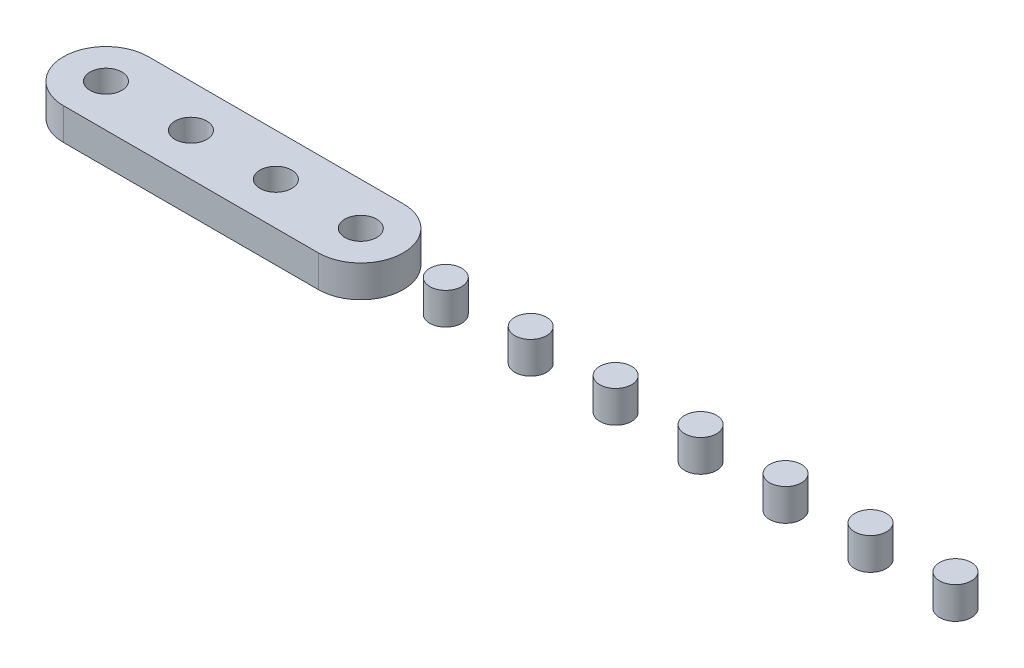
ISO-10303-21;
HEADER;
FILE_DESCRIPTION(('STEP AP214'),'2;1');
FILE_NAME('part.step','',(''),(''),'','','');
FILE_SCHEMA(('AUTOMOTIVE_DESIGN { 1 0 10303 214 1 1 1 1 }'));
ENDSEC;
DATA;
#1=APPLICATION_CONTEXT('core data for automotive mechanical design processes');
#2=APPLICATION_PROTOCOL_DEFINITION('international standard','automotive_design',2000,#1);
#3=PRODUCT_CONTEXT('',#1,'mechanical');
#4=PRODUCT('Part','Part','',(#3));
#5=PRODUCT_RELATED_PRODUCT_CATEGORY('part','',(#4));
#6=PRODUCT_DEFINITION_FORMATION('','',#4);
#7=PRODUCT_DEFINITION_CONTEXT('part definition',#1,'design');
#8=PRODUCT_DEFINITION('design','',#6,#7);
#9=PRODUCT_DEFINITION_SHAPE('','',#8);
#10=(LENGTH_UNIT() NAMED_UNIT(*) SI_UNIT(.MILLI.,.METRE.));
#11=(NAMED_UNIT(*) PLANE_ANGLE_UNIT() SI_UNIT($,.RADIAN.));
#12=(NAMED_UNIT(*) SI_UNIT($,.STERADIAN.) SOLID_ANGLE_UNIT());
#13=UNCERTAINTY_MEASURE_WITH_UNIT(LENGTH_MEASURE(1.E-05),#10,'distance_accuracy_value','');
#14=(GEOMETRIC_REPRESENTATION_CONTEXT(3) GLOBAL_UNCERTAINTY_ASSIGNED_CONTEXT((#13)) GLOBAL_UNIT_ASSIGNED_CONTEXT((#10,
#11,#12)) REPRESENTATION_CONTEXT('',''));
#15=CARTESIAN_POINT('',(0.,0.,0.));
#16=DIRECTION('',(0.,0.,1.));
#17=DIRECTION('',(1.,0.,0.));
#18=AXIS2_PLACEMENT_3D('',#15,#16,#17);
#19=CARTESIAN_POINT('',(80.,3.,0.));
#20=DIRECTION('',(0.,-1.,0.));
#21=DIRECTION('',(0.,0.,-1.));
#22=AXIS2_PLACEMENT_3D('',#19,#20,#21);
#23=CYLINDRICAL_SURFACE('',#22,1.5);
#24=CARTESIAN_POINT('',(80.,3.,0.));
#25=DIRECTION('',(0.,1.,0.));
#26=DIRECTION('',(0.,0.,1.));
#27=AXIS2_PLACEMENT_3D('',#24,#25,#26);
#28=CIRCLE('',#27,1.5);
#29=CARTESIAN_POINT('',(80.,3.,1.5));
#30=VERTEX_POINT('',#29);
#31=EDGE_CURVE('E11',#30,#30,#28,.T.);
#32=ORIENTED_EDGE('',*,*,#31,.F.);
#33=EDGE_LOOP('',(#32));
#34=FACE_BOUND('',#33,.T.);
#35=CARTESIAN_POINT('',(80.,0.,0.));
#36=DIRECTION('',(0.,1.,0.));
#37=DIRECTION('',(0.,0.,1.));
#38=AXIS2_PLACEMENT_3D('',#35,#36,#37);
#39=CIRCLE('',#38,1.5);
#40=CARTESIAN_POINT('',(80.,0.,1.5));
#41=VERTEX_POINT('',#40);
#42=EDGE_CURVE('E43',#41,#41,#39,.T.);
#43=ORIENTED_EDGE('',*,*,#42,.T.);
#44=EDGE_LOOP('',(#43));
#45=FACE_BOUND('',#44,.T.);
#46=ADVANCED_FACE('F40',(#34,#45),#23,.T.);
#47=CARTESIAN_POINT('',(80.,3.,0.));
#48=DIRECTION('',(0.,1.,0.));
#49=DIRECTION('',(0.,0.,1.));
#50=AXIS2_PLACEMENT_3D('',#47,#48,#49);
#51=PLANE('',#50);
#52=ORIENTED_EDGE('',*,*,#31,.T.);
#53=EDGE_LOOP('',(#52));
#54=FACE_BOUND('',#53,.T.);
#55=ADVANCED_FACE('F55',(#54),#51,.T.);
#56=CARTESIAN_POINT('',(80.,0.,0.));
#57=DIRECTION('',(0.,1.,0.));
#58=DIRECTION('',(0.,0.,1.));
#59=AXIS2_PLACEMENT_3D('',#56,#57,#58);
#60=PLANE('',#59);
#61=ORIENTED_EDGE('',*,*,#42,.F.);
#62=EDGE_LOOP('',(#61));
#63=FACE_BOUND('',#62,.T.);
#64=ADVANCED_FACE('F53',(#63),#60,.F.);
#65=CLOSED_SHELL('',(#46,#55,#64));
#66=MANIFOLD_SOLID_BREP('B2',#65);
#67=CARTESIAN_POINT('',(72.,3.,0.));
#68=DIRECTION('',(0.,-1.,0.));
#69=DIRECTION('',(0.,0.,-1.));
#70=AXIS2_PLACEMENT_3D('',#67,#68,#69);
#71=CYLINDRICAL_SURFACE('',#70,1.5);
#72=CARTESIAN_POINT('',(72.,3.,0.));
#73=DIRECTION('',(0.,1.,0.));
#74=DIRECTION('',(0.,0.,1.));
#75=AXIS2_PLACEMENT_3D('',#72,#73,#74);
#76=CIRCLE('',#75,1.5);
#77=CARTESIAN_POINT('',(72.,3.,1.5));
#78=VERTEX_POINT('',#77);
#79=EDGE_CURVE('E39',#78,#78,#76,.T.);
#80=ORIENTED_EDGE('',*,*,#79,.F.);
#81=EDGE_LOOP('',(#80));
#82=FACE_BOUND('',#81,.T.);
#83=CARTESIAN_POINT('',(72.,0.,0.));
#84=DIRECTION('',(0.,1.,0.));
#85=DIRECTION('',(0.,0.,1.));
#86=AXIS2_PLACEMENT_3D('',#83,#84,#85);
#87=CIRCLE('',#86,1.5);
#88=CARTESIAN_POINT('',(72.,0.,1.5));
#89=VERTEX_POINT('',#88);
#90=EDGE_CURVE('E92',#89,#89,#87,.T.);
#91=ORIENTED_EDGE('',*,*,#90,.T.);
#92=EDGE_LOOP('',(#91));
#93=FACE_BOUND('',#92,.T.);
#94=ADVANCED_FACE('F89',(#82,#93),#71,.T.);
#95=CARTESIAN_POINT('',(72.,3.,0.));
#96=DIRECTION('',(0.,1.,0.));
#97=DIRECTION('',(0.,0.,1.));
#98=AXIS2_PLACEMENT_3D('',#95,#96,#97);
#99=PLANE('',#98);
#100=ORIENTED_EDGE('',*,*,#79,.T.);
#101=EDGE_LOOP('',(#100));
#102=FACE_BOUND('',#101,.T.);
#103=ADVANCED_FACE('F104',(#102),#99,.T.);
#104=CARTESIAN_POINT('',(72.,0.,0.));
#105=DIRECTION('',(0.,1.,0.));
#106=DIRECTION('',(0.,0.,1.));
#107=AXIS2_PLACEMENT_3D('',#104,#105,#106);
#108=PLANE('',#107);
#109=ORIENTED_EDGE('',*,*,#90,.F.);
#110=EDGE_LOOP('',(#109));
#111=FACE_BOUND('',#110,.T.);
#112=ADVANCED_FACE('F102',(#111),#108,.F.);
#113=CLOSED_SHELL('',(#94,#103,#112));
#114=MANIFOLD_SOLID_BREP('B6',#113);
#115=CARTESIAN_POINT('',(64.,3.,0.));
#116=DIRECTION('',(0.,-1.,0.));
#117=DIRECTION('',(0.,0.,-1.));
#118=AXIS2_PLACEMENT_3D('',#115,#116,#117);
#119=CYLINDRICAL_SURFACE('',#118,1.5);
#120=CARTESIAN_POINT('',(64.,3.,0.));
#121=DIRECTION('',(0.,1.,0.));
#122=DIRECTION('',(0.,0.,1.));
#123=AXIS2_PLACEMENT_3D('',#120,#121,#122);
#124=CIRCLE('',#123,1.5);
#125=CARTESIAN_POINT('',(64.,3.,1.5));
#126=VERTEX_POINT('',#125);
#127=EDGE_CURVE('E88',#126,#126,#124,.T.);
#128=ORIENTED_EDGE('',*,*,#127,.F.);
#129=EDGE_LOOP('',(#128));
#130=FACE_BOUND('',#129,.T.);
#131=CARTESIAN_POINT('',(64.,0.,0.));
#132=DIRECTION('',(0.,1.,0.));
#133=DIRECTION('',(0.,0.,1.));
#134=AXIS2_PLACEMENT_3D('',#131,#132,#133);
#135=CIRCLE('',#134,1.5);
#136=CARTESIAN_POINT('',(64.,0.,1.5));
#137=VERTEX_POINT('',#136);
#138=EDGE_CURVE('E141',#137,#137,#135,.T.);
#139=ORIENTED_EDGE('',*,*,#138,.T.);
#140=EDGE_LOOP('',(#139));
#141=FACE_BOUND('',#140,.T.);
#142=ADVANCED_FACE('F138',(#130,#141),#119,.T.);
#143=CARTESIAN_POINT('',(64.,3.,0.));
#144=DIRECTION('',(0.,1.,0.));
#145=DIRECTION('',(0.,0.,1.));
#146=AXIS2_PLACEMENT_3D('',#143,#144,#145);
#147=PLANE('',#146);
#148=ORIENTED_EDGE('',*,*,#127,.T.);
#149=EDGE_LOOP('',(#148));
#150=FACE_BOUND('',#149,.T.);
#151=ADVANCED_FACE('F153',(#150),#147,.T.);
#152=CARTESIAN_POINT('',(64.,0.,0.));
#153=DIRECTION('',(0.,1.,0.));
#154=DIRECTION('',(0.,0.,1.));
#155=AXIS2_PLACEMENT_3D('',#152,#153,#154);
#156=PLANE('',#155);
#157=ORIENTED_EDGE('',*,*,#138,.F.);
#158=EDGE_LOOP('',(#157));
#159=FACE_BOUND('',#158,.T.);
#160=ADVANCED_FACE('F151',(#159),#156,.F.);
#161=CLOSED_SHELL('',(#142,#151,#160));
#162=MANIFOLD_SOLID_BREP('B34',#161);
#163=CARTESIAN_POINT('',(56.,3.,0.));
#164=DIRECTION('',(0.,-1.,0.));
#165=DIRECTION('',(0.,0.,-1.));
#166=AXIS2_PLACEMENT_3D('',#163,#164,#165);
#167=CYLINDRICAL_SURFACE('',#166,1.5);
#168=CARTESIAN_POINT('',(56.,3.,0.));
#169=DIRECTION('',(0.,1.,0.));
#170=DIRECTION('',(0.,0.,1.));
#171=AXIS2_PLACEMENT_3D('',#168,#169,#170);
#172=CIRCLE('',#171,1.5);
#173=CARTESIAN_POINT('',(56.,3.,1.5));
#174=VERTEX_POINT('',#173);
#175=EDGE_CURVE('E137',#174,#174,#172,.T.);
#176=ORIENTED_EDGE('',*,*,#175,.F.);
#177=EDGE_LOOP('',(#176));
#178=FACE_BOUND('',#177,.T.);
#179=CARTESIAN_POINT('',(56.,0.,0.));
#180=DIRECTION('',(0.,1.,0.));
#181=DIRECTION('',(0.,0.,1.));
#182=AXIS2_PLACEMENT_3D('',#179,#180,#181);
#183=CIRCLE('',#182,1.5);
#184=CARTESIAN_POINT('',(56.,0.,1.5));
#185=VERTEX_POINT('',#184);
#186=EDGE_CURVE('E190',#185,#185,#183,.T.);
#187=ORIENTED_EDGE('',*,*,#186,.T.);
#188=EDGE_LOOP('',(#187));
#189=FACE_BOUND('',#188,.T.);
#190=ADVANCED_FACE('F187',(#178,#189),#167,.T.);
#191=CARTESIAN_POINT('',(56.,3.,0.));
#192=DIRECTION('',(0.,1.,0.));
#193=DIRECTION('',(0.,0.,1.));
#194=AXIS2_PLACEMENT_3D('',#191,#192,#193);
#195=PLANE('',#194);
#196=ORIENTED_EDGE('',*,*,#175,.T.);
#197=EDGE_LOOP('',(#196));
#198=FACE_BOUND('',#197,.T.);
#199=ADVANCED_FACE('F202',(#198),#195,.T.);
#200=CARTESIAN_POINT('',(56.,0.,0.));
#201=DIRECTION('',(0.,1.,0.));
#202=DIRECTION('',(0.,0.,1.));
#203=AXIS2_PLACEMENT_3D('',#200,#201,#202);
#204=PLANE('',#203);
#205=ORIENTED_EDGE('',*,*,#186,.F.);
#206=EDGE_LOOP('',(#205));
#207=FACE_BOUND('',#206,.T.);
#208=ADVANCED_FACE('F200',(#207),#204,.F.);
#209=CLOSED_SHELL('',(#190,#199,#208));
#210=MANIFOLD_SOLID_BREP('B83',#209);
#211=CARTESIAN_POINT('',(48.,3.,0.));
#212=DIRECTION('',(0.,-1.,0.));
#213=DIRECTION('',(0.,0.,-1.));
#214=AXIS2_PLACEMENT_3D('',#211,#212,#213);
#215=CYLINDRICAL_SURFACE('',#214,1.5);
#216=CARTESIAN_POINT('',(48.,3.,0.));
#217=DIRECTION('',(0.,1.,0.));
#218=DIRECTION('',(0.,0.,1.));
#219=AXIS2_PLACEMENT_3D('',#216,#217,#218);
#220=CIRCLE('',#219,1.5);
#221=CARTESIAN_POINT('',(48.,3.,1.5));
#222=VERTEX_POINT('',#221);
#223=EDGE_CURVE('E186',#222,#222,#220,.T.);
#224=ORIENTED_EDGE('',*,*,#223,.F.);
#225=EDGE_LOOP('',(#224));
#226=FACE_BOUND('',#225,.T.);
#227=CARTESIAN_POINT('',(48.,0.,0.));
#228=DIRECTION('',(0.,1.,0.));
#229=DIRECTION('',(0.,0.,1.));
#230=AXIS2_PLACEMENT_3D('',#227,#228,#229);
#231=CIRCLE('',#230,1.5);
#232=CARTESIAN_POINT('',(48.,0.,1.5));
#233=VERTEX_POINT('',#232);
#234=EDGE_CURVE('E239',#233,#233,#231,.T.);
#235=ORIENTED_EDGE('',*,*,#234,.T.);
#236=EDGE_LOOP('',(#235));
#237=FACE_BOUND('',#236,.T.);
#238=ADVANCED_FACE('F236',(#226,#237),#215,.T.);
#239=CARTESIAN_POINT('',(48.,3.,0.));
#240=DIRECTION('',(0.,1.,0.));
#241=DIRECTION('',(0.,0.,1.));
#242=AXIS2_PLACEMENT_3D('',#239,#240,#241);
#243=PLANE('',#242);
#244=ORIENTED_EDGE('',*,*,#223,.T.);
#245=EDGE_LOOP('',(#244));
#246=FACE_BOUND('',#245,.T.);
#247=ADVANCED_FACE('F251',(#246),#243,.T.);
#248=CARTESIAN_POINT('',(48.,0.,0.));
#249=DIRECTION('',(0.,1.,0.));
#250=DIRECTION('',(0.,0.,1.));
#251=AXIS2_PLACEMENT_3D('',#248,#249,#250);
#252=PLANE('',#251);
#253=ORIENTED_EDGE('',*,*,#234,.F.);
#254=EDGE_LOOP('',(#253));
#255=FACE_BOUND('',#254,.T.);
#256=ADVANCED_FACE('F249',(#255),#252,.F.);
#257=CLOSED_SHELL('',(#238,#247,#256));
#258=MANIFOLD_SOLID_BREP('B132',#257);
#259=CARTESIAN_POINT('',(40.,3.,0.));
#260=DIRECTION('',(0.,-1.,0.));
#261=DIRECTION('',(0.,0.,-1.));
#262=AXIS2_PLACEMENT_3D('',#259,#260,#261);
#263=CYLINDRICAL_SURFACE('',#262,1.5);
#264=CARTESIAN_POINT('',(40.,3.,0.));
#265=DIRECTION('',(0.,1.,0.));
#266=DIRECTION('',(0.,0.,1.));
#267=AXIS2_PLACEMENT_3D('',#264,#265,#266);
#268=CIRCLE('',#267,1.5);
#269=CARTESIAN_POINT('',(40.,3.,1.5));
#270=VERTEX_POINT('',#269);
#271=EDGE_CURVE('E235',#270,#270,#268,.T.);
#272=ORIENTED_EDGE('',*,*,#271,.F.);
#273=EDGE_LOOP('',(#272));
#274=FACE_BOUND('',#273,.T.);
#275=CARTESIAN_POINT('',(40.,0.,0.));
#276=DIRECTION('',(0.,1.,0.));
#277=DIRECTION('',(0.,0.,1.));
#278=AXIS2_PLACEMENT_3D('',#275,#276,#277);
#279=CIRCLE('',#278,1.5);
#280=CARTESIAN_POINT('',(40.,0.,1.5));
#281=VERTEX_POINT('',#280);
#282=EDGE_CURVE('E288',#281,#281,#279,.T.);
#283=ORIENTED_EDGE('',*,*,#282,.T.);
#284=EDGE_LOOP('',(#283));
#285=FACE_BOUND('',#284,.T.);
#286=ADVANCED_FACE('F285',(#274,#285),#263,.T.);
#287=CARTESIAN_POINT('',(40.,3.,0.));
#288=DIRECTION('',(0.,1.,0.));
#289=DIRECTION('',(0.,0.,1.));
#290=AXIS2_PLACEMENT_3D('',#287,#288,#289);
#291=PLANE('',#290);
#292=ORIENTED_EDGE('',*,*,#271,.T.);
#293=EDGE_LOOP('',(#292));
#294=FACE_BOUND('',#293,.T.);
#295=ADVANCED_FACE('F300',(#294),#291,.T.);
#296=CARTESIAN_POINT('',(40.,0.,0.));
#297=DIRECTION('',(0.,1.,0.));
#298=DIRECTION('',(0.,0.,1.));
#299=AXIS2_PLACEMENT_3D('',#296,#297,#298);
#300=PLANE('',#299);
#301=ORIENTED_EDGE('',*,*,#282,.F.);
#302=EDGE_LOOP('',(#301));
#303=FACE_BOUND('',#302,.T.);
#304=ADVANCED_FACE('F298',(#303),#300,.F.);
#305=CLOSED_SHELL('',(#286,#295,#304));
#306=MANIFOLD_SOLID_BREP('B181',#305);
#307=CARTESIAN_POINT('',(32.,3.,0.));
#308=DIRECTION('',(0.,-1.,0.));
#309=DIRECTION('',(0.,0.,-1.));
#310=AXIS2_PLACEMENT_3D('',#307,#308,#309);
#311=CYLINDRICAL_SURFACE('',#310,1.5);
#312=CARTESIAN_POINT('',(32.,3.,0.));
#313=DIRECTION('',(0.,1.,0.));
#314=DIRECTION('',(0.,0.,1.));
#315=AXIS2_PLACEMENT_3D('',#312,#313,#314);
#316=CIRCLE('',#315,1.5);
#317=CARTESIAN_POINT('',(32.,3.,1.5));
#318=VERTEX_POINT('',#317);
#319=EDGE_CURVE('E284',#318,#318,#316,.T.);
#320=ORIENTED_EDGE('',*,*,#319,.F.);
#321=EDGE_LOOP('',(#320));
#322=FACE_BOUND('',#321,.T.);
#323=CARTESIAN_POINT('',(32.,0.,0.));
#324=DIRECTION('',(0.,1.,0.));
#325=DIRECTION('',(0.,0.,1.));
#326=AXIS2_PLACEMENT_3D('',#323,#324,#325);
#327=CIRCLE('',#326,1.5);
#328=CARTESIAN_POINT('',(32.,0.,1.5));
#329=VERTEX_POINT('',#328);
#330=EDGE_CURVE('E338',#329,#329,#327,.T.);
#331=ORIENTED_EDGE('',*,*,#330,.T.);
#332=EDGE_LOOP('',(#331));
#333=FACE_BOUND('',#332,.T.);
#334=ADVANCED_FACE('F335',(#322,#333),#311,.T.);
#335=CARTESIAN_POINT('',(32.,3.,0.));
#336=DIRECTION('',(0.,1.,0.));
#337=DIRECTION('',(0.,0.,1.));
#338=AXIS2_PLACEMENT_3D('',#335,#336,#337);
#339=PLANE('',#338);
#340=ORIENTED_EDGE('',*,*,#319,.T.);
#341=EDGE_LOOP('',(#340));
#342=FACE_BOUND('',#341,.T.);
#343=ADVANCED_FACE('F350',(#342),#339,.T.);
#344=CARTESIAN_POINT('',(32.,0.,0.));
#345=DIRECTION('',(0.,1.,0.));
#346=DIRECTION('',(0.,0.,1.));
#347=AXIS2_PLACEMENT_3D('',#344,#345,#346);
#348=PLANE('',#347);
#349=ORIENTED_EDGE('',*,*,#330,.F.);
#350=EDGE_LOOP('',(#349));
#351=FACE_BOUND('',#350,.T.);
#352=ADVANCED_FACE('F348',(#351),#348,.F.);
#353=CLOSED_SHELL('',(#334,#343,#352));
#354=MANIFOLD_SOLID_BREP('B230',#353);
#355=CARTESIAN_POINT('',(0.,3.,0.));
#356=DIRECTION('',(0.,1.,0.));
#357=DIRECTION('',(0.,0.,1.));
#358=AXIS2_PLACEMENT_3D('',#355,#356,#357);
#359=PLANE('',#358);
#360=CARTESIAN_POINT('',(16.,3.,0.));
#361=DIRECTION('',(0.,1.,0.));
#362=DIRECTION('',(0.,0.,1.));
#363=AXIS2_PLACEMENT_3D('',#360,#361,#362);
#364=CIRCLE('',#363,1.5);
#365=CARTESIAN_POINT('',(16.,3.,1.5));
#366=VERTEX_POINT('',#365);
#367=EDGE_CURVE('E464',#366,#366,#364,.T.);
#368=ORIENTED_EDGE('',*,*,#367,.F.);
#369=EDGE_LOOP('',(#368));
#370=FACE_BOUND('',#369,.T.);
#371=CARTESIAN_POINT('',(0.,3.,0.));
#372=DIRECTION('',(0.,1.,0.));
#373=DIRECTION('',(0.,0.,1.));
#374=AXIS2_PLACEMENT_3D('',#371,#372,#373);
#375=CIRCLE('',#374,1.5);
#376=CARTESIAN_POINT('',(0.,3.,1.5));
#377=VERTEX_POINT('',#376);
#378=EDGE_CURVE('E443',#377,#377,#375,.T.);
#379=ORIENTED_EDGE('',*,*,#378,.F.);
#380=EDGE_LOOP('',(#379));
#381=FACE_BOUND('',#380,.T.);
#382=CARTESIAN_POINT('',(0.,3.,0.));
#383=DIRECTION('',(0.,1.,0.));
#384=DIRECTION('',(0.,0.,1.));
#385=AXIS2_PLACEMENT_3D('',#382,#383,#384);
#386=CIRCLE('',#385,4.);
#387=CARTESIAN_POINT('',(0.,3.,-4.));
#388=VERTEX_POINT('',#387);
#389=CARTESIAN_POINT('',(0.,3.,4.));
#390=VERTEX_POINT('',#389);
#391=EDGE_CURVE('E428',#388,#390,#386,.T.);
#392=ORIENTED_EDGE('',*,*,#391,.T.);
#393=DIRECTION('',(1.,0.,0.));
#394=VECTOR('',#393,1.);
#395=CARTESIAN_POINT('',(0.,3.,4.));
#396=LINE('',#395,#394);
#397=CARTESIAN_POINT('',(24.,3.,4.));
#398=VERTEX_POINT('',#397);
#399=EDGE_CURVE('E423',#390,#398,#396,.T.);
#400=ORIENTED_EDGE('',*,*,#399,.T.);
#401=CARTESIAN_POINT('',(24.,3.,0.));
#402=DIRECTION('',(0.,1.,0.));
#403=DIRECTION('',(0.,0.,1.));
#404=AXIS2_PLACEMENT_3D('',#401,#402,#403);
#405=CIRCLE('',#404,4.);
#406=CARTESIAN_POINT('',(24.,3.,-4.));
#407=VERTEX_POINT('',#406);
#408=EDGE_CURVE('E426',#398,#407,#405,.T.);
#409=ORIENTED_EDGE('',*,*,#408,.T.);
#410=DIRECTION('',(-1.,0.,0.));
#411=VECTOR('',#410,1.);
#412=CARTESIAN_POINT('',(0.,3.,-4.));
#413=LINE('',#412,#411);
#414=EDGE_CURVE('E393',#407,#388,#413,.T.);
#415=ORIENTED_EDGE('',*,*,#414,.T.);
#416=EDGE_LOOP('',(#392,#400,#409,#415));
#417=FACE_BOUND('',#416,.T.);
#418=CARTESIAN_POINT('',(8.,3.,0.));
#419=DIRECTION('',(0.,1.,0.));
#420=DIRECTION('',(0.,0.,1.));
#421=AXIS2_PLACEMENT_3D('',#418,#419,#420);
#422=CIRCLE('',#421,1.5);
#423=CARTESIAN_POINT('',(8.,3.,1.5));
#424=VERTEX_POINT('',#423);
#425=EDGE_CURVE('E458',#424,#424,#422,.T.);
#426=ORIENTED_EDGE('',*,*,#425,.F.);
#427=EDGE_LOOP('',(#426));
#428=FACE_BOUND('',#427,.T.);
#429=CARTESIAN_POINT('',(24.,3.,0.));
#430=DIRECTION('',(0.,1.,0.));
#431=DIRECTION('',(0.,0.,1.));
#432=AXIS2_PLACEMENT_3D('',#429,#430,#431);
#433=CIRCLE('',#432,1.5);
#434=CARTESIAN_POINT('',(24.,3.,1.5));
#435=VERTEX_POINT('',#434);
#436=EDGE_CURVE('E470',#435,#435,#433,.T.);
#437=ORIENTED_EDGE('',*,*,#436,.F.);
#438=EDGE_LOOP('',(#437));
#439=FACE_BOUND('',#438,.T.);
#440=ADVANCED_FACE('F376',(#370,#381,#417,#428,#439),#359,.T.);
#441=CARTESIAN_POINT('',(0.,0.,0.));
#442=DIRECTION('',(0.,1.,0.));
#443=DIRECTION('',(0.,0.,1.));
#444=AXIS2_PLACEMENT_3D('',#441,#442,#443);
#445=PLANE('',#444);
#446=CARTESIAN_POINT('',(16.,0.,0.));
#447=DIRECTION('',(0.,1.,0.));
#448=DIRECTION('',(0.,0.,1.));
#449=AXIS2_PLACEMENT_3D('',#446,#447,#448);
#450=CIRCLE('',#449,1.5);
#451=CARTESIAN_POINT('',(16.,0.,1.5));
#452=VERTEX_POINT('',#451);
#453=EDGE_CURVE('E467',#452,#452,#450,.T.);
#454=ORIENTED_EDGE('',*,*,#453,.T.);
#455=EDGE_LOOP('',(#454));
#456=FACE_BOUND('',#455,.T.);
#457=CARTESIAN_POINT('',(0.,0.,0.));
#458=DIRECTION('',(0.,1.,0.));
#459=DIRECTION('',(0.,0.,1.));
#460=AXIS2_PLACEMENT_3D('',#457,#458,#459);
#461=CIRCLE('',#460,1.5);
#462=CARTESIAN_POINT('',(0.,0.,1.5));
#463=VERTEX_POINT('',#462);
#464=EDGE_CURVE('E455',#463,#463,#461,.T.);
#465=ORIENTED_EDGE('',*,*,#464,.T.);
#466=EDGE_LOOP('',(#465));
#467=FACE_BOUND('',#466,.T.);
#468=CARTESIAN_POINT('',(0.,0.,0.));
#469=DIRECTION('',(0.,1.,0.));
#470=DIRECTION('',(0.,0.,1.));
#471=AXIS2_PLACEMENT_3D('',#468,#469,#470);
#472=CIRCLE('',#471,4.);
#473=CARTESIAN_POINT('',(0.,0.,-4.));
#474=VERTEX_POINT('',#473);
#475=CARTESIAN_POINT('',(0.,0.,4.));
#476=VERTEX_POINT('',#475);
#477=EDGE_CURVE('E440',#474,#476,#472,.T.);
#478=ORIENTED_EDGE('',*,*,#477,.F.);
#479=DIRECTION('',(-1.,0.,0.));
#480=VECTOR('',#479,1.);
#481=CARTESIAN_POINT('',(0.,0.,-4.));
#482=LINE('',#481,#480);
#483=CARTESIAN_POINT('',(24.,0.,-4.));
#484=VERTEX_POINT('',#483);
#485=EDGE_CURVE('E416',#484,#474,#482,.T.);
#486=ORIENTED_EDGE('',*,*,#485,.F.);
#487=CARTESIAN_POINT('',(24.,0.,0.));
#488=DIRECTION('',(0.,1.,0.));
#489=DIRECTION('',(0.,0.,1.));
#490=AXIS2_PLACEMENT_3D('',#487,#488,#489);
#491=CIRCLE('',#490,4.);
#492=CARTESIAN_POINT('',(24.,0.,4.));
#493=VERTEX_POINT('',#492);
#494=EDGE_CURVE('E410',#493,#484,#491,.T.);
#495=ORIENTED_EDGE('',*,*,#494,.F.);
#496=DIRECTION('',(1.,0.,0.));
#497=VECTOR('',#496,1.);
#498=CARTESIAN_POINT('',(0.,0.,4.));
#499=LINE('',#498,#497);
#500=EDGE_CURVE('E432',#476,#493,#499,.T.);
#501=ORIENTED_EDGE('',*,*,#500,.F.);
#502=EDGE_LOOP('',(#478,#486,#495,#501));
#503=FACE_BOUND('',#502,.T.);
#504=CARTESIAN_POINT('',(8.,0.,0.));
#505=DIRECTION('',(0.,1.,0.));
#506=DIRECTION('',(0.,0.,1.));
#507=AXIS2_PLACEMENT_3D('',#504,#505,#506);
#508=CIRCLE('',#507,1.5);
#509=CARTESIAN_POINT('',(8.,0.,1.5));
#510=VERTEX_POINT('',#509);
#511=EDGE_CURVE('E461',#510,#510,#508,.T.);
#512=ORIENTED_EDGE('',*,*,#511,.T.);
#513=EDGE_LOOP('',(#512));
#514=FACE_BOUND('',#513,.T.);
#515=CARTESIAN_POINT('',(24.,0.,0.));
#516=DIRECTION('',(0.,1.,0.));
#517=DIRECTION('',(0.,0.,1.));
#518=AXIS2_PLACEMENT_3D('',#515,#516,#517);
#519=CIRCLE('',#518,1.5);
#520=CARTESIAN_POINT('',(24.,0.,1.5));
#521=VERTEX_POINT('',#520);
#522=EDGE_CURVE('E473',#521,#521,#519,.T.);
#523=ORIENTED_EDGE('',*,*,#522,.T.);
#524=EDGE_LOOP('',(#523));
#525=FACE_BOUND('',#524,.T.);
#526=ADVANCED_FACE('F451',(#456,#467,#503,#514,#525),#445,.F.);
#527=CARTESIAN_POINT('',(0.,3.,0.));
#528=DIRECTION('',(0.,-1.,0.));
#529=DIRECTION('',(0.,0.,-1.));
#530=AXIS2_PLACEMENT_3D('',#527,#528,#529);
#531=CYLINDRICAL_SURFACE('',#530,4.);
#532=ORIENTED_EDGE('',*,*,#477,.T.);
#533=DIRECTION('',(0.,-1.,0.));
#534=VECTOR('',#533,1.);
#535=CARTESIAN_POINT('',(0.,3.,4.));
#536=LINE('',#535,#534);
#537=EDGE_CURVE('E333',#390,#476,#536,.T.);
#538=ORIENTED_EDGE('',*,*,#537,.F.);
#539=ORIENTED_EDGE('',*,*,#391,.F.);
#540=DIRECTION('',(0.,-1.,0.));
#541=VECTOR('',#540,1.);
#542=CARTESIAN_POINT('',(0.,3.,-4.));
#543=LINE('',#542,#541);
#544=EDGE_CURVE('E436',#388,#474,#543,.T.);
#545=ORIENTED_EDGE('',*,*,#544,.T.);
#546=EDGE_LOOP('',(#532,#538,#539,#545));
#547=FACE_BOUND('',#546,.T.);
#548=ADVANCED_FACE('F378',(#547),#531,.T.);
#549=CARTESIAN_POINT('',(0.,3.,4.));
#550=DIRECTION('',(0.,0.,-1.));
#551=DIRECTION('',(-1.,0.,0.));
#552=AXIS2_PLACEMENT_3D('',#549,#550,#551);
#553=PLANE('',#552);
#554=ORIENTED_EDGE('',*,*,#500,.T.);
#555=DIRECTION('',(0.,-1.,0.));
#556=VECTOR('',#555,1.);
#557=CARTESIAN_POINT('',(24.,3.,4.));
#558=LINE('',#557,#556);
#559=EDGE_CURVE('E385',#398,#493,#558,.T.);
#560=ORIENTED_EDGE('',*,*,#559,.F.);
#561=ORIENTED_EDGE('',*,*,#399,.F.);
#562=ORIENTED_EDGE('',*,*,#537,.T.);
#563=EDGE_LOOP('',(#554,#560,#561,#562));
#564=FACE_BOUND('',#563,.T.);
#565=ADVANCED_FACE('F431',(#564),#553,.F.);
#566=CARTESIAN_POINT('',(24.,3.,0.));
#567=DIRECTION('',(0.,-1.,0.));
#568=DIRECTION('',(0.,0.,-1.));
#569=AXIS2_PLACEMENT_3D('',#566,#567,#568);
#570=CYLINDRICAL_SURFACE('',#569,4.);
#571=ORIENTED_EDGE('',*,*,#494,.T.);
#572=DIRECTION('',(0.,-1.,0.));
#573=VECTOR('',#572,1.);
#574=CARTESIAN_POINT('',(24.,3.,-4.));
#575=LINE('',#574,#573);
#576=EDGE_CURVE('E433',#407,#484,#575,.T.);
#577=ORIENTED_EDGE('',*,*,#576,.F.);
#578=ORIENTED_EDGE('',*,*,#408,.F.);
#579=ORIENTED_EDGE('',*,*,#559,.T.);
#580=EDGE_LOOP('',(#571,#577,#578,#579));
#581=FACE_BOUND('',#580,.T.);
#582=ADVANCED_FACE('F434',(#581),#570,.T.);
#583=CARTESIAN_POINT('',(0.,3.,-4.));
#584=DIRECTION('',(0.,0.,1.));
#585=DIRECTION('',(1.,0.,0.));
#586=AXIS2_PLACEMENT_3D('',#583,#584,#585);
#587=PLANE('',#586);
#588=ORIENTED_EDGE('',*,*,#485,.T.);
#589=ORIENTED_EDGE('',*,*,#544,.F.);
#590=ORIENTED_EDGE('',*,*,#414,.F.);
#591=ORIENTED_EDGE('',*,*,#576,.T.);
#592=EDGE_LOOP('',(#588,#589,#590,#591));
#593=FACE_BOUND('',#592,.T.);
#594=ADVANCED_FACE('F448',(#593),#587,.F.);
#595=CARTESIAN_POINT('',(0.,3.,0.));
#596=DIRECTION('',(0.,-1.,0.));
#597=DIRECTION('',(0.,0.,-1.));
#598=AXIS2_PLACEMENT_3D('',#595,#596,#597);
#599=CYLINDRICAL_SURFACE('',#598,1.5);
#600=ORIENTED_EDGE('',*,*,#378,.T.);
#601=EDGE_LOOP('',(#600));
#602=FACE_BOUND('',#601,.T.);
#603=ORIENTED_EDGE('',*,*,#464,.F.);
#604=EDGE_LOOP('',(#603));
#605=FACE_BOUND('',#604,.T.);
#606=ADVANCED_FACE('F493',(#602,#605),#599,.F.);
#607=CARTESIAN_POINT('',(8.,3.,0.));
#608=DIRECTION('',(0.,-1.,0.));
#609=DIRECTION('',(0.,0.,-1.));
#610=AXIS2_PLACEMENT_3D('',#607,#608,#609);
#611=CYLINDRICAL_SURFACE('',#610,1.5);
#612=ORIENTED_EDGE('',*,*,#425,.T.);
#613=EDGE_LOOP('',(#612));
#614=FACE_BOUND('',#613,.T.);
#615=ORIENTED_EDGE('',*,*,#511,.F.);
#616=EDGE_LOOP('',(#615));
#617=FACE_BOUND('',#616,.T.);
#618=ADVANCED_FACE('F539',(#614,#617),#611,.F.);
#619=CARTESIAN_POINT('',(16.,3.,0.));
#620=DIRECTION('',(0.,-1.,0.));
#621=DIRECTION('',(0.,0.,-1.));
#622=AXIS2_PLACEMENT_3D('',#619,#620,#621);
#623=CYLINDRICAL_SURFACE('',#622,1.5);
#624=ORIENTED_EDGE('',*,*,#367,.T.);
#625=EDGE_LOOP('',(#624));
#626=FACE_BOUND('',#625,.T.);
#627=ORIENTED_EDGE('',*,*,#453,.F.);
#628=EDGE_LOOP('',(#627));
#629=FACE_BOUND('',#628,.T.);
#630=ADVANCED_FACE('F547',(#626,#629),#623,.F.);
#631=CARTESIAN_POINT('',(24.,3.,0.));
#632=DIRECTION('',(0.,-1.,0.));
#633=DIRECTION('',(0.,0.,-1.));
#634=AXIS2_PLACEMENT_3D('',#631,#632,#633);
#635=CYLINDRICAL_SURFACE('',#634,1.5);
#636=ORIENTED_EDGE('',*,*,#436,.T.);
#637=EDGE_LOOP('',(#636));
#638=FACE_BOUND('',#637,.T.);
#639=ORIENTED_EDGE('',*,*,#522,.F.);
#640=EDGE_LOOP('',(#639));
#641=FACE_BOUND('',#640,.T.);
#642=ADVANCED_FACE('F479',(#638,#641),#635,.F.);
#643=CLOSED_SHELL('',(#440,#526,#548,#565,#582,#594,#606,#618,#630,#642));
#644=MANIFOLD_SOLID_BREP('B279',#643);
#645=ADVANCED_BREP_SHAPE_REPRESENTATION('',(#18,#66,#114,#162,#210,#258,#306,#354,#644),#14);
#646=SHAPE_DEFINITION_REPRESENTATION(#9,#645);
ENDSEC;
END-ISO-10303-21;
